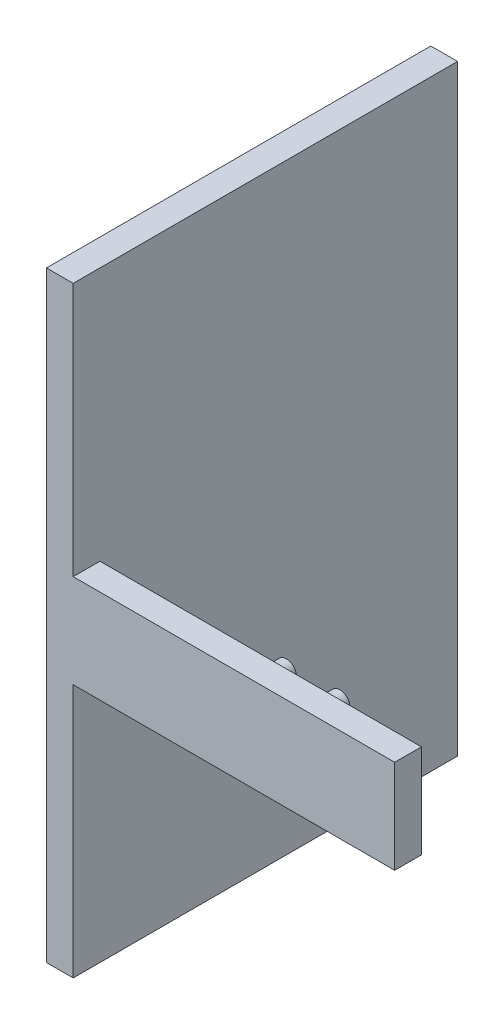
ISO-10303-21;
HEADER;
FILE_DESCRIPTION(('STEP AP214'),'2;1');
FILE_NAME('part.step','',(''),(''),'','','');
FILE_SCHEMA(('AUTOMOTIVE_DESIGN { 1 0 10303 214 1 1 1 1 }'));
ENDSEC;
DATA;
#1=APPLICATION_CONTEXT('core data for automotive mechanical design processes');
#2=APPLICATION_PROTOCOL_DEFINITION('international standard','automotive_design',2000,#1);
#3=PRODUCT_CONTEXT('',#1,'mechanical');
#4=PRODUCT('Part','Part','',(#3));
#5=PRODUCT_RELATED_PRODUCT_CATEGORY('part','',(#4));
#6=PRODUCT_DEFINITION_FORMATION('','',#4);
#7=PRODUCT_DEFINITION_CONTEXT('part definition',#1,'design');
#8=PRODUCT_DEFINITION('design','',#6,#7);
#9=PRODUCT_DEFINITION_SHAPE('','',#8);
#10=(LENGTH_UNIT() NAMED_UNIT(*) SI_UNIT(.MILLI.,.METRE.));
#11=(NAMED_UNIT(*) PLANE_ANGLE_UNIT() SI_UNIT($,.RADIAN.));
#12=(NAMED_UNIT(*) SI_UNIT($,.STERADIAN.) SOLID_ANGLE_UNIT());
#13=UNCERTAINTY_MEASURE_WITH_UNIT(LENGTH_MEASURE(1.E-05),#10,'distance_accuracy_value','');
#14=(GEOMETRIC_REPRESENTATION_CONTEXT(3) GLOBAL_UNCERTAINTY_ASSIGNED_CONTEXT((#13)) GLOBAL_UNIT_ASSIGNED_CONTEXT((#10,
#11,#12)) REPRESENTATION_CONTEXT('',''));
#15=CARTESIAN_POINT('',(0.,0.,0.));
#16=DIRECTION('',(0.,0.,1.));
#17=DIRECTION('',(1.,0.,0.));
#18=AXIS2_PLACEMENT_3D('',#15,#16,#17);
#19=CARTESIAN_POINT('',(-126.7,-7.,22.5));
#20=DIRECTION('',(0.,1.,0.));
#21=DIRECTION('',(0.,0.,1.));
#22=AXIS2_PLACEMENT_3D('',#19,#20,#21);
#23=PLANE('',#22);
#24=DIRECTION('',(0.,0.,1.));
#25=VECTOR('',#24,1.);
#26=CARTESIAN_POINT('',(-122.7,-7.,22.5));
#27=LINE('',#26,#25);
#28=CARTESIAN_POINT('',(-122.7,-7.,18.5));
#29=VERTEX_POINT('',#28);
#30=CARTESIAN_POINT('',(-122.7,-7.00000000000001,22.5));
#31=VERTEX_POINT('',#30);
#32=EDGE_CURVE('E112',#29,#31,#27,.T.);
#33=ORIENTED_EDGE('',*,*,#32,.F.);
#34=DIRECTION('',(1.,0.,0.));
#35=VECTOR('',#34,1.);
#36=CARTESIAN_POINT('',(-126.7,-7.,18.5));
#37=LINE('',#36,#35);
#38=CARTESIAN_POINT('',(-74.6,-7.,18.5));
#39=VERTEX_POINT('',#38);
#40=EDGE_CURVE('E65',#29,#39,#37,.T.);
#41=ORIENTED_EDGE('',*,*,#40,.T.);
#42=DIRECTION('',(0.,0.,-1.));
#43=VECTOR('',#42,1.);
#44=CARTESIAN_POINT('',(-74.6,-7.,22.5));
#45=LINE('',#44,#43);
#46=CARTESIAN_POINT('',(-74.6,-7.,22.5));
#47=VERTEX_POINT('',#46);
#48=EDGE_CURVE('E153',#47,#39,#45,.T.);
#49=ORIENTED_EDGE('',*,*,#48,.F.);
#50=DIRECTION('',(1.,0.,0.));
#51=VECTOR('',#50,1.);
#52=CARTESIAN_POINT('',(-126.7,-7.,22.5));
#53=LINE('',#52,#51);
#54=EDGE_CURVE('E139',#31,#47,#53,.T.);
#55=ORIENTED_EDGE('',*,*,#54,.F.);
#56=EDGE_LOOP('',(#33,#41,#49,#55));
#57=FACE_BOUND('',#56,.T.);
#58=ADVANCED_FACE('F37',(#57),#23,.F.);
#59=CARTESIAN_POINT('',(-126.7,7.,22.5));
#60=DIRECTION('',(0.,-1.,0.));
#61=DIRECTION('',(0.,0.,-1.));
#62=AXIS2_PLACEMENT_3D('',#59,#60,#61);
#63=PLANE('',#62);
#64=DIRECTION('',(0.,0.,-1.));
#65=VECTOR('',#64,1.);
#66=CARTESIAN_POINT('',(-122.7,7.,22.5));
#67=LINE('',#66,#65);
#68=CARTESIAN_POINT('',(-122.7,6.99999999999999,22.5));
#69=VERTEX_POINT('',#68);
#70=CARTESIAN_POINT('',(-122.7,7.,18.5));
#71=VERTEX_POINT('',#70);
#72=EDGE_CURVE('E74',#69,#71,#67,.T.);
#73=ORIENTED_EDGE('',*,*,#72,.F.);
#74=DIRECTION('',(-1.,0.,0.));
#75=VECTOR('',#74,1.);
#76=CARTESIAN_POINT('',(-126.7,7.,22.5));
#77=LINE('',#76,#75);
#78=CARTESIAN_POINT('',(-74.6,7.,22.5));
#79=VERTEX_POINT('',#78);
#80=EDGE_CURVE('E143',#79,#69,#77,.T.);
#81=ORIENTED_EDGE('',*,*,#80,.F.);
#82=DIRECTION('',(0.,0.,-1.));
#83=VECTOR('',#82,1.);
#84=CARTESIAN_POINT('',(-74.6,7.,22.5));
#85=LINE('',#84,#83);
#86=CARTESIAN_POINT('',(-74.6,7.,18.5));
#87=VERTEX_POINT('',#86);
#88=EDGE_CURVE('E145',#79,#87,#85,.T.);
#89=ORIENTED_EDGE('',*,*,#88,.T.);
#90=DIRECTION('',(-1.,0.,0.));
#91=VECTOR('',#90,1.);
#92=CARTESIAN_POINT('',(-126.7,7.,18.5));
#93=LINE('',#92,#91);
#94=EDGE_CURVE('E140',#87,#71,#93,.T.);
#95=ORIENTED_EDGE('',*,*,#94,.T.);
#96=EDGE_LOOP('',(#73,#81,#89,#95));
#97=FACE_BOUND('',#96,.T.);
#98=ADVANCED_FACE('F247',(#97),#63,.F.);
#99=CARTESIAN_POINT('',(0.,0.,18.5));
#100=DIRECTION('',(0.,0.,-1.));
#101=DIRECTION('',(-1.,0.,0.));
#102=AXIS2_PLACEMENT_3D('',#99,#100,#101);
#103=PLANE('',#102);
#104=CARTESIAN_POINT('',(-97.6,-4.,18.5));
#105=DIRECTION('',(0.,0.,1.));
#106=DIRECTION('',(1.,0.,0.));
#107=AXIS2_PLACEMENT_3D('',#104,#105,#106);
#108=CIRCLE('',#107,1.5);
#109=CARTESIAN_POINT('',(-96.1,-4.,18.5));
#110=VERTEX_POINT('',#109);
#111=EDGE_CURVE('E214',#110,#110,#108,.T.);
#112=ORIENTED_EDGE('',*,*,#111,.T.);
#113=EDGE_LOOP('',(#112));
#114=FACE_BOUND('',#113,.T.);
#115=CARTESIAN_POINT('',(-97.6,4.,18.5));
#116=DIRECTION('',(0.,0.,1.));
#117=DIRECTION('',(1.,0.,0.));
#118=AXIS2_PLACEMENT_3D('',#115,#116,#117);
#119=CIRCLE('',#118,1.5);
#120=CARTESIAN_POINT('',(-96.1,4.,18.5));
#121=VERTEX_POINT('',#120);
#122=EDGE_CURVE('E208',#121,#121,#119,.T.);
#123=ORIENTED_EDGE('',*,*,#122,.T.);
#124=EDGE_LOOP('',(#123));
#125=FACE_BOUND('',#124,.T.);
#126=CARTESIAN_POINT('',(-89.6,-4.,18.5));
#127=DIRECTION('',(0.,0.,1.));
#128=DIRECTION('',(1.,0.,0.));
#129=AXIS2_PLACEMENT_3D('',#126,#127,#128);
#130=CIRCLE('',#129,1.5);
#131=CARTESIAN_POINT('',(-88.1,-4.,18.5));
#132=VERTEX_POINT('',#131);
#133=EDGE_CURVE('E202',#132,#132,#130,.T.);
#134=ORIENTED_EDGE('',*,*,#133,.T.);
#135=EDGE_LOOP('',(#134));
#136=FACE_BOUND('',#135,.T.);
#137=CARTESIAN_POINT('',(-89.6,4.,18.5));
#138=DIRECTION('',(0.,0.,1.));
#139=DIRECTION('',(1.,0.,0.));
#140=AXIS2_PLACEMENT_3D('',#137,#138,#139);
#141=CIRCLE('',#140,1.5);
#142=CARTESIAN_POINT('',(-88.1,4.,18.5));
#143=VERTEX_POINT('',#142);
#144=EDGE_CURVE('E196',#143,#143,#141,.T.);
#145=ORIENTED_EDGE('',*,*,#144,.T.);
#146=EDGE_LOOP('',(#145));
#147=FACE_BOUND('',#146,.T.);
#148=ORIENTED_EDGE('',*,*,#40,.F.);
#149=DIRECTION('',(0.,1.,0.));
#150=VECTOR('',#149,1.);
#151=CARTESIAN_POINT('',(-122.7,0.,18.5));
#152=LINE('',#151,#150);
#153=EDGE_CURVE('E155',#29,#71,#152,.T.);
#154=ORIENTED_EDGE('',*,*,#153,.T.);
#155=ORIENTED_EDGE('',*,*,#94,.F.);
#156=DIRECTION('',(0.,1.,0.));
#157=VECTOR('',#156,1.);
#158=CARTESIAN_POINT('',(-74.6,-7.,18.5));
#159=LINE('',#158,#157);
#160=EDGE_CURVE('E147',#39,#87,#159,.T.);
#161=ORIENTED_EDGE('',*,*,#160,.F.);
#162=EDGE_LOOP('',(#148,#154,#155,#161));
#163=FACE_BOUND('',#162,.T.);
#164=ADVANCED_FACE('F171',(#114,#125,#136,#147,#163),#103,.T.);
#165=CARTESIAN_POINT('',(-126.7,-7.,22.5));
#166=DIRECTION('',(1.,0.,0.));
#167=DIRECTION('',(0.,0.,-1.));
#168=AXIS2_PLACEMENT_3D('',#165,#166,#167);
#169=PLANE('',#168);
#170=CARTESIAN_POINT('',(-126.7,30.,15.));
#171=DIRECTION('',(1.,0.,0.));
#172=DIRECTION('',(0.,0.,-1.));
#173=AXIS2_PLACEMENT_3D('',#170,#171,#172);
#174=CIRCLE('',#173,1.5);
#175=CARTESIAN_POINT('',(-126.7,30.,13.5));
#176=VERTEX_POINT('',#175);
#177=EDGE_CURVE('E11',#176,#176,#174,.F.);
#178=ORIENTED_EDGE('',*,*,#177,.F.);
#179=EDGE_LOOP('',(#178));
#180=FACE_BOUND('',#179,.T.);
#181=CARTESIAN_POINT('',(-126.7,30.,-15.));
#182=DIRECTION('',(1.,0.,0.));
#183=DIRECTION('',(0.,0.,-1.));
#184=AXIS2_PLACEMENT_3D('',#181,#182,#183);
#185=CIRCLE('',#184,1.5);
#186=CARTESIAN_POINT('',(-126.7,30.,-16.5));
#187=VERTEX_POINT('',#186);
#188=EDGE_CURVE('E46',#187,#187,#185,.F.);
#189=ORIENTED_EDGE('',*,*,#188,.F.);
#190=EDGE_LOOP('',(#189));
#191=FACE_BOUND('',#190,.T.);
#192=CARTESIAN_POINT('',(-126.7,-30.,15.));
#193=DIRECTION('',(1.,0.,0.));
#194=DIRECTION('',(0.,0.,-1.));
#195=AXIS2_PLACEMENT_3D('',#192,#193,#194);
#196=CIRCLE('',#195,1.5);
#197=CARTESIAN_POINT('',(-126.7,-30.,13.5));
#198=VERTEX_POINT('',#197);
#199=EDGE_CURVE('E160',#198,#198,#196,.F.);
#200=ORIENTED_EDGE('',*,*,#199,.F.);
#201=EDGE_LOOP('',(#200));
#202=FACE_BOUND('',#201,.T.);
#203=CARTESIAN_POINT('',(-126.7,-30.,-15.));
#204=DIRECTION('',(1.,0.,0.));
#205=DIRECTION('',(0.,0.,-1.));
#206=AXIS2_PLACEMENT_3D('',#203,#204,#205);
#207=CIRCLE('',#206,1.5);
#208=CARTESIAN_POINT('',(-126.7,-30.,-16.5));
#209=VERTEX_POINT('',#208);
#210=EDGE_CURVE('E157',#209,#209,#207,.F.);
#211=ORIENTED_EDGE('',*,*,#210,.F.);
#212=EDGE_LOOP('',(#211));
#213=FACE_BOUND('',#212,.T.);
#214=DIRECTION('',(0.,-1.,0.));
#215=VECTOR('',#214,1.);
#216=CARTESIAN_POINT('',(-126.7,-7.,22.5));
#217=LINE('',#216,#215);
#218=CARTESIAN_POINT('',(-126.7,45.,22.5));
#219=VERTEX_POINT('',#218);
#220=CARTESIAN_POINT('',(-126.7,-45.,22.5));
#221=VERTEX_POINT('',#220);
#222=EDGE_CURVE('E129',#219,#221,#217,.T.);
#223=ORIENTED_EDGE('',*,*,#222,.F.);
#224=DIRECTION('',(0.,0.,1.));
#225=VECTOR('',#224,1.);
#226=CARTESIAN_POINT('',(-126.7,45.,22.5));
#227=LINE('',#226,#225);
#228=CARTESIAN_POINT('',(-126.7,45.,-35.));
#229=VERTEX_POINT('',#228);
#230=EDGE_CURVE('E116',#229,#219,#227,.T.);
#231=ORIENTED_EDGE('',*,*,#230,.F.);
#232=DIRECTION('',(0.,1.,0.));
#233=VECTOR('',#232,1.);
#234=CARTESIAN_POINT('',(-126.7,-45.,-35.));
#235=LINE('',#234,#233);
#236=CARTESIAN_POINT('',(-126.7,-45.,-35.));
#237=VERTEX_POINT('',#236);
#238=EDGE_CURVE('E189',#237,#229,#235,.T.);
#239=ORIENTED_EDGE('',*,*,#238,.F.);
#240=DIRECTION('',(0.,0.,-1.));
#241=VECTOR('',#240,1.);
#242=CARTESIAN_POINT('',(-126.7,-45.,22.5));
#243=LINE('',#242,#241);
#244=EDGE_CURVE('E180',#221,#237,#243,.T.);
#245=ORIENTED_EDGE('',*,*,#244,.F.);
#246=EDGE_LOOP('',(#223,#231,#239,#245));
#247=FACE_BOUND('',#246,.T.);
#248=ADVANCED_FACE('F39',(#180,#191,#202,#213,#247),#169,.F.);
#249=CARTESIAN_POINT('',(-74.6,-7.,22.5));
#250=DIRECTION('',(-1.,0.,0.));
#251=DIRECTION('',(0.,0.,1.));
#252=AXIS2_PLACEMENT_3D('',#249,#250,#251);
#253=PLANE('',#252);
#254=ORIENTED_EDGE('',*,*,#160,.T.);
#255=ORIENTED_EDGE('',*,*,#88,.F.);
#256=DIRECTION('',(0.,1.,0.));
#257=VECTOR('',#256,1.);
#258=CARTESIAN_POINT('',(-74.6,-7.,22.5));
#259=LINE('',#258,#257);
#260=EDGE_CURVE('E54',#47,#79,#259,.T.);
#261=ORIENTED_EDGE('',*,*,#260,.F.);
#262=ORIENTED_EDGE('',*,*,#48,.T.);
#263=EDGE_LOOP('',(#254,#255,#261,#262));
#264=FACE_BOUND('',#263,.T.);
#265=ADVANCED_FACE('F170',(#264),#253,.F.);
#266=CARTESIAN_POINT('',(0.,0.,22.5));
#267=DIRECTION('',(0.,0.,-1.));
#268=DIRECTION('',(-1.,0.,0.));
#269=AXIS2_PLACEMENT_3D('',#266,#267,#268);
#270=PLANE('',#269);
#271=ORIENTED_EDGE('',*,*,#222,.T.);
#272=DIRECTION('',(-1.,0.,0.));
#273=VECTOR('',#272,1.);
#274=CARTESIAN_POINT('',(-122.7,-45.,22.5));
#275=LINE('',#274,#273);
#276=CARTESIAN_POINT('',(-122.7,-45.,22.5));
#277=VERTEX_POINT('',#276);
#278=EDGE_CURVE('E121',#277,#221,#275,.T.);
#279=ORIENTED_EDGE('',*,*,#278,.F.);
#280=DIRECTION('',(0.,-1.,0.));
#281=VECTOR('',#280,1.);
#282=CARTESIAN_POINT('',(-122.7,-45.,22.5));
#283=LINE('',#282,#281);
#284=EDGE_CURVE('E107',#31,#277,#283,.T.);
#285=ORIENTED_EDGE('',*,*,#284,.F.);
#286=ORIENTED_EDGE('',*,*,#54,.T.);
#287=ORIENTED_EDGE('',*,*,#260,.T.);
#288=ORIENTED_EDGE('',*,*,#80,.T.);
#289=CARTESIAN_POINT('',(-122.7,45.,22.5));
#290=VERTEX_POINT('',#289);
#291=EDGE_CURVE('E115',#290,#69,#283,.T.);
#292=ORIENTED_EDGE('',*,*,#291,.F.);
#293=DIRECTION('',(-1.,0.,0.));
#294=VECTOR('',#293,1.);
#295=CARTESIAN_POINT('',(-122.7,45.,22.5));
#296=LINE('',#295,#294);
#297=EDGE_CURVE('E186',#290,#219,#296,.T.);
#298=ORIENTED_EDGE('',*,*,#297,.T.);
#299=EDGE_LOOP('',(#271,#279,#285,#286,#287,#288,#292,#298));
#300=FACE_BOUND('',#299,.T.);
#301=ADVANCED_FACE('F127',(#300),#270,.F.);
#302=CARTESIAN_POINT('',(-122.7,0.,0.));
#303=DIRECTION('',(-1.,0.,0.));
#304=DIRECTION('',(0.,0.,1.));
#305=AXIS2_PLACEMENT_3D('',#302,#303,#304);
#306=PLANE('',#305);
#307=ORIENTED_EDGE('',*,*,#153,.F.);
#308=ORIENTED_EDGE('',*,*,#32,.T.);
#309=ORIENTED_EDGE('',*,*,#284,.T.);
#310=DIRECTION('',(0.,0.,-1.));
#311=VECTOR('',#310,1.);
#312=CARTESIAN_POINT('',(-122.7,-45.,22.5));
#313=LINE('',#312,#311);
#314=CARTESIAN_POINT('',(-122.7,-45.,-35.));
#315=VERTEX_POINT('',#314);
#316=EDGE_CURVE('E110',#277,#315,#313,.T.);
#317=ORIENTED_EDGE('',*,*,#316,.T.);
#318=DIRECTION('',(0.,1.,0.));
#319=VECTOR('',#318,1.);
#320=CARTESIAN_POINT('',(-122.7,-45.,-35.));
#321=LINE('',#320,#319);
#322=CARTESIAN_POINT('',(-122.7,45.,-35.));
#323=VERTEX_POINT('',#322);
#324=EDGE_CURVE('E125',#315,#323,#321,.T.);
#325=ORIENTED_EDGE('',*,*,#324,.T.);
#326=DIRECTION('',(0.,0.,1.));
#327=VECTOR('',#326,1.);
#328=CARTESIAN_POINT('',(-122.7,45.,22.5));
#329=LINE('',#328,#327);
#330=EDGE_CURVE('E191',#323,#290,#329,.T.);
#331=ORIENTED_EDGE('',*,*,#330,.T.);
#332=ORIENTED_EDGE('',*,*,#291,.T.);
#333=ORIENTED_EDGE('',*,*,#72,.T.);
#334=EDGE_LOOP('',(#307,#308,#309,#317,#325,#331,#332,#333));
#335=FACE_BOUND('',#334,.T.);
#336=ADVANCED_FACE('F109',(#335),#306,.F.);
#337=CARTESIAN_POINT('',(-122.7,-45.,22.5));
#338=DIRECTION('',(0.,1.,0.));
#339=DIRECTION('',(0.,0.,1.));
#340=AXIS2_PLACEMENT_3D('',#337,#338,#339);
#341=PLANE('',#340);
#342=ORIENTED_EDGE('',*,*,#244,.T.);
#343=DIRECTION('',(-1.,0.,0.));
#344=VECTOR('',#343,1.);
#345=CARTESIAN_POINT('',(-122.7,-45.,-35.));
#346=LINE('',#345,#344);
#347=EDGE_CURVE('E123',#315,#237,#346,.T.);
#348=ORIENTED_EDGE('',*,*,#347,.F.);
#349=ORIENTED_EDGE('',*,*,#316,.F.);
#350=ORIENTED_EDGE('',*,*,#278,.T.);
#351=EDGE_LOOP('',(#342,#348,#349,#350));
#352=FACE_BOUND('',#351,.T.);
#353=ADVANCED_FACE('F120',(#352),#341,.F.);
#354=CARTESIAN_POINT('',(-122.7,-45.,-35.));
#355=DIRECTION('',(0.,0.,1.));
#356=DIRECTION('',(1.,0.,0.));
#357=AXIS2_PLACEMENT_3D('',#354,#355,#356);
#358=PLANE('',#357);
#359=ORIENTED_EDGE('',*,*,#238,.T.);
#360=DIRECTION('',(-1.,0.,0.));
#361=VECTOR('',#360,1.);
#362=CARTESIAN_POINT('',(-122.7,45.,-35.));
#363=LINE('',#362,#361);
#364=EDGE_CURVE('E133',#323,#229,#363,.T.);
#365=ORIENTED_EDGE('',*,*,#364,.F.);
#366=ORIENTED_EDGE('',*,*,#324,.F.);
#367=ORIENTED_EDGE('',*,*,#347,.T.);
#368=EDGE_LOOP('',(#359,#365,#366,#367));
#369=FACE_BOUND('',#368,.T.);
#370=ADVANCED_FACE('F264',(#369),#358,.F.);
#371=CARTESIAN_POINT('',(-122.7,45.,22.5));
#372=DIRECTION('',(0.,-1.,0.));
#373=DIRECTION('',(0.,0.,-1.));
#374=AXIS2_PLACEMENT_3D('',#371,#372,#373);
#375=PLANE('',#374);
#376=ORIENTED_EDGE('',*,*,#230,.T.);
#377=ORIENTED_EDGE('',*,*,#297,.F.);
#378=ORIENTED_EDGE('',*,*,#330,.F.);
#379=ORIENTED_EDGE('',*,*,#364,.T.);
#380=EDGE_LOOP('',(#376,#377,#378,#379));
#381=FACE_BOUND('',#380,.T.);
#382=ADVANCED_FACE('F184',(#381),#375,.F.);
#383=CARTESIAN_POINT('',(-89.6,4.,18.5));
#384=DIRECTION('',(0.,0.,-1.));
#385=DIRECTION('',(-1.,0.,0.));
#386=AXIS2_PLACEMENT_3D('',#383,#384,#385);
#387=CYLINDRICAL_SURFACE('',#386,1.5);
#388=ORIENTED_EDGE('',*,*,#144,.F.);
#389=EDGE_LOOP('',(#388));
#390=FACE_BOUND('',#389,.T.);
#391=CARTESIAN_POINT('',(-89.6,4.,15.7));
#392=DIRECTION('',(0.,0.,1.));
#393=DIRECTION('',(1.,0.,0.));
#394=AXIS2_PLACEMENT_3D('',#391,#392,#393);
#395=CIRCLE('',#394,1.5);
#396=CARTESIAN_POINT('',(-88.1,4.,15.7));
#397=VERTEX_POINT('',#396);
#398=EDGE_CURVE('E199',#397,#397,#395,.T.);
#399=ORIENTED_EDGE('',*,*,#398,.T.);
#400=EDGE_LOOP('',(#399));
#401=FACE_BOUND('',#400,.T.);
#402=ADVANCED_FACE('F270',(#390,#401),#387,.T.);
#403=CARTESIAN_POINT('',(-89.6,4.,15.7));
#404=DIRECTION('',(0.,0.,1.));
#405=DIRECTION('',(1.,0.,0.));
#406=AXIS2_PLACEMENT_3D('',#403,#404,#405);
#407=PLANE('',#406);
#408=ORIENTED_EDGE('',*,*,#398,.F.);
#409=EDGE_LOOP('',(#408));
#410=FACE_BOUND('',#409,.T.);
#411=ADVANCED_FACE('F275',(#410),#407,.F.);
#412=CARTESIAN_POINT('',(-89.6,-4.,18.5));
#413=DIRECTION('',(0.,0.,-1.));
#414=DIRECTION('',(-1.,0.,0.));
#415=AXIS2_PLACEMENT_3D('',#412,#413,#414);
#416=CYLINDRICAL_SURFACE('',#415,1.5);
#417=ORIENTED_EDGE('',*,*,#133,.F.);
#418=EDGE_LOOP('',(#417));
#419=FACE_BOUND('',#418,.T.);
#420=CARTESIAN_POINT('',(-89.6,-4.,15.7));
#421=DIRECTION('',(0.,0.,1.));
#422=DIRECTION('',(1.,0.,0.));
#423=AXIS2_PLACEMENT_3D('',#420,#421,#422);
#424=CIRCLE('',#423,1.5);
#425=CARTESIAN_POINT('',(-88.1,-4.,15.7));
#426=VERTEX_POINT('',#425);
#427=EDGE_CURVE('E205',#426,#426,#424,.T.);
#428=ORIENTED_EDGE('',*,*,#427,.T.);
#429=EDGE_LOOP('',(#428));
#430=FACE_BOUND('',#429,.T.);
#431=ADVANCED_FACE('F279',(#419,#430),#416,.T.);
#432=CARTESIAN_POINT('',(-89.6,-4.,15.7));
#433=DIRECTION('',(0.,0.,1.));
#434=DIRECTION('',(1.,0.,0.));
#435=AXIS2_PLACEMENT_3D('',#432,#433,#434);
#436=PLANE('',#435);
#437=ORIENTED_EDGE('',*,*,#427,.F.);
#438=EDGE_LOOP('',(#437));
#439=FACE_BOUND('',#438,.T.);
#440=ADVANCED_FACE('F283',(#439),#436,.F.);
#441=CARTESIAN_POINT('',(-97.6,4.,18.5));
#442=DIRECTION('',(0.,0.,-1.));
#443=DIRECTION('',(-1.,0.,0.));
#444=AXIS2_PLACEMENT_3D('',#441,#442,#443);
#445=CYLINDRICAL_SURFACE('',#444,1.5);
#446=ORIENTED_EDGE('',*,*,#122,.F.);
#447=EDGE_LOOP('',(#446));
#448=FACE_BOUND('',#447,.T.);
#449=CARTESIAN_POINT('',(-97.6,4.,15.7));
#450=DIRECTION('',(0.,0.,1.));
#451=DIRECTION('',(1.,0.,0.));
#452=AXIS2_PLACEMENT_3D('',#449,#450,#451);
#453=CIRCLE('',#452,1.5);
#454=CARTESIAN_POINT('',(-96.1,4.,15.7));
#455=VERTEX_POINT('',#454);
#456=EDGE_CURVE('E211',#455,#455,#453,.T.);
#457=ORIENTED_EDGE('',*,*,#456,.T.);
#458=EDGE_LOOP('',(#457));
#459=FACE_BOUND('',#458,.T.);
#460=ADVANCED_FACE('F287',(#448,#459),#445,.T.);
#461=CARTESIAN_POINT('',(-97.6,4.,15.7));
#462=DIRECTION('',(0.,0.,1.));
#463=DIRECTION('',(1.,0.,0.));
#464=AXIS2_PLACEMENT_3D('',#461,#462,#463);
#465=PLANE('',#464);
#466=ORIENTED_EDGE('',*,*,#456,.F.);
#467=EDGE_LOOP('',(#466));
#468=FACE_BOUND('',#467,.T.);
#469=ADVANCED_FACE('F291',(#468),#465,.F.);
#470=CARTESIAN_POINT('',(-97.6,-4.,18.5));
#471=DIRECTION('',(0.,0.,-1.));
#472=DIRECTION('',(-1.,0.,0.));
#473=AXIS2_PLACEMENT_3D('',#470,#471,#472);
#474=CYLINDRICAL_SURFACE('',#473,1.5);
#475=ORIENTED_EDGE('',*,*,#111,.F.);
#476=EDGE_LOOP('',(#475));
#477=FACE_BOUND('',#476,.T.);
#478=CARTESIAN_POINT('',(-97.6,-4.,15.7));
#479=DIRECTION('',(0.,0.,1.));
#480=DIRECTION('',(1.,0.,0.));
#481=AXIS2_PLACEMENT_3D('',#478,#479,#480);
#482=CIRCLE('',#481,1.5);
#483=CARTESIAN_POINT('',(-96.1,-4.,15.7));
#484=VERTEX_POINT('',#483);
#485=EDGE_CURVE('E217',#484,#484,#482,.T.);
#486=ORIENTED_EDGE('',*,*,#485,.T.);
#487=EDGE_LOOP('',(#486));
#488=FACE_BOUND('',#487,.T.);
#489=ADVANCED_FACE('F295',(#477,#488),#474,.T.);
#490=CARTESIAN_POINT('',(-97.6,-4.,15.7));
#491=DIRECTION('',(0.,0.,1.));
#492=DIRECTION('',(1.,0.,0.));
#493=AXIS2_PLACEMENT_3D('',#490,#491,#492);
#494=PLANE('',#493);
#495=ORIENTED_EDGE('',*,*,#485,.F.);
#496=EDGE_LOOP('',(#495));
#497=FACE_BOUND('',#496,.T.);
#498=ADVANCED_FACE('F299',(#497),#494,.F.);
#499=CARTESIAN_POINT('',(-126.7,-30.,-15.));
#500=DIRECTION('',(-1.,0.,0.));
#501=DIRECTION('',(0.,0.,1.));
#502=AXIS2_PLACEMENT_3D('',#499,#500,#501);
#503=CYLINDRICAL_SURFACE('',#502,1.5);
#504=ORIENTED_EDGE('',*,*,#210,.T.);
#505=EDGE_LOOP('',(#504));
#506=FACE_BOUND('',#505,.T.);
#507=CARTESIAN_POINT('',(-129.5,-30.,-15.));
#508=DIRECTION('',(1.,0.,0.));
#509=DIRECTION('',(0.,0.,-1.));
#510=AXIS2_PLACEMENT_3D('',#507,#508,#509);
#511=CIRCLE('',#510,1.5);
#512=CARTESIAN_POINT('',(-129.5,-30.,-16.5));
#513=VERTEX_POINT('',#512);
#514=EDGE_CURVE('E220',#513,#513,#511,.T.);
#515=ORIENTED_EDGE('',*,*,#514,.T.);
#516=EDGE_LOOP('',(#515));
#517=FACE_BOUND('',#516,.T.);
#518=ADVANCED_FACE('F303',(#506,#517),#503,.T.);
#519=CARTESIAN_POINT('',(-129.5,-30.,-15.));
#520=DIRECTION('',(1.,0.,0.));
#521=DIRECTION('',(0.,0.,-1.));
#522=AXIS2_PLACEMENT_3D('',#519,#520,#521);
#523=PLANE('',#522);
#524=ORIENTED_EDGE('',*,*,#514,.F.);
#525=EDGE_LOOP('',(#524));
#526=FACE_BOUND('',#525,.T.);
#527=ADVANCED_FACE('F307',(#526),#523,.F.);
#528=CARTESIAN_POINT('',(-126.7,-30.,15.));
#529=DIRECTION('',(-1.,0.,0.));
#530=DIRECTION('',(0.,0.,1.));
#531=AXIS2_PLACEMENT_3D('',#528,#529,#530);
#532=CYLINDRICAL_SURFACE('',#531,1.5);
#533=ORIENTED_EDGE('',*,*,#199,.T.);
#534=EDGE_LOOP('',(#533));
#535=FACE_BOUND('',#534,.T.);
#536=CARTESIAN_POINT('',(-129.5,-30.,15.));
#537=DIRECTION('',(1.,0.,0.));
#538=DIRECTION('',(0.,0.,-1.));
#539=AXIS2_PLACEMENT_3D('',#536,#537,#538);
#540=CIRCLE('',#539,1.5);
#541=CARTESIAN_POINT('',(-129.5,-30.,13.5));
#542=VERTEX_POINT('',#541);
#543=EDGE_CURVE('E225',#542,#542,#540,.T.);
#544=ORIENTED_EDGE('',*,*,#543,.T.);
#545=EDGE_LOOP('',(#544));
#546=FACE_BOUND('',#545,.T.);
#547=ADVANCED_FACE('F311',(#535,#546),#532,.T.);
#548=CARTESIAN_POINT('',(-129.5,-30.,15.));
#549=DIRECTION('',(1.,0.,0.));
#550=DIRECTION('',(0.,0.,-1.));
#551=AXIS2_PLACEMENT_3D('',#548,#549,#550);
#552=PLANE('',#551);
#553=ORIENTED_EDGE('',*,*,#543,.F.);
#554=EDGE_LOOP('',(#553));
#555=FACE_BOUND('',#554,.T.);
#556=ADVANCED_FACE('F315',(#555),#552,.F.);
#557=CARTESIAN_POINT('',(-126.7,30.,-15.));
#558=DIRECTION('',(-1.,0.,0.));
#559=DIRECTION('',(0.,0.,1.));
#560=AXIS2_PLACEMENT_3D('',#557,#558,#559);
#561=CYLINDRICAL_SURFACE('',#560,1.5);
#562=ORIENTED_EDGE('',*,*,#188,.T.);
#563=EDGE_LOOP('',(#562));
#564=FACE_BOUND('',#563,.T.);
#565=CARTESIAN_POINT('',(-129.5,30.,-15.));
#566=DIRECTION('',(1.,0.,0.));
#567=DIRECTION('',(0.,0.,-1.));
#568=AXIS2_PLACEMENT_3D('',#565,#566,#567);
#569=CIRCLE('',#568,1.5);
#570=CARTESIAN_POINT('',(-129.5,30.,-16.5));
#571=VERTEX_POINT('',#570);
#572=EDGE_CURVE('E228',#571,#571,#569,.T.);
#573=ORIENTED_EDGE('',*,*,#572,.T.);
#574=EDGE_LOOP('',(#573));
#575=FACE_BOUND('',#574,.T.);
#576=ADVANCED_FACE('F165',(#564,#575),#561,.T.);
#577=CARTESIAN_POINT('',(-129.5,30.,-15.));
#578=DIRECTION('',(1.,0.,0.));
#579=DIRECTION('',(0.,0.,-1.));
#580=AXIS2_PLACEMENT_3D('',#577,#578,#579);
#581=PLANE('',#580);
#582=ORIENTED_EDGE('',*,*,#572,.F.);
#583=EDGE_LOOP('',(#582));
#584=FACE_BOUND('',#583,.T.);
#585=ADVANCED_FACE('F243',(#584),#581,.F.);
#586=CARTESIAN_POINT('',(-126.7,30.,15.));
#587=DIRECTION('',(-1.,0.,0.));
#588=DIRECTION('',(0.,0.,1.));
#589=AXIS2_PLACEMENT_3D('',#586,#587,#588);
#590=CYLINDRICAL_SURFACE('',#589,1.5);
#591=ORIENTED_EDGE('',*,*,#177,.T.);
#592=EDGE_LOOP('',(#591));
#593=FACE_BOUND('',#592,.T.);
#594=CARTESIAN_POINT('',(-129.5,30.,15.));
#595=DIRECTION('',(1.,0.,0.));
#596=DIRECTION('',(0.,0.,-1.));
#597=AXIS2_PLACEMENT_3D('',#594,#595,#596);
#598=CIRCLE('',#597,1.5);
#599=CARTESIAN_POINT('',(-129.5,30.,13.5));
#600=VERTEX_POINT('',#599);
#601=EDGE_CURVE('E231',#600,#600,#598,.T.);
#602=ORIENTED_EDGE('',*,*,#601,.T.);
#603=EDGE_LOOP('',(#602));
#604=FACE_BOUND('',#603,.T.);
#605=ADVANCED_FACE('F235',(#593,#604),#590,.T.);
#606=CARTESIAN_POINT('',(-129.5,30.,15.));
#607=DIRECTION('',(1.,0.,0.));
#608=DIRECTION('',(0.,0.,-1.));
#609=AXIS2_PLACEMENT_3D('',#606,#607,#608);
#610=PLANE('',#609);
#611=ORIENTED_EDGE('',*,*,#601,.F.);
#612=EDGE_LOOP('',(#611));
#613=FACE_BOUND('',#612,.T.);
#614=ADVANCED_FACE('F237',(#613),#610,.F.);
#615=CLOSED_SHELL('',(#58,#98,#164,#248,#265,#301,#336,#353,#370,#382,#402,#411,#431,#440,#460,
#469,#489,#498,#518,#527,#547,#556,#576,#585,#605,#614));
#616=MANIFOLD_SOLID_BREP('B2',#615);
#617=ADVANCED_BREP_SHAPE_REPRESENTATION('',(#18,#616),#14);
#618=SHAPE_DEFINITION_REPRESENTATION(#9,#617);
ENDSEC;
END-ISO-10303-21;
